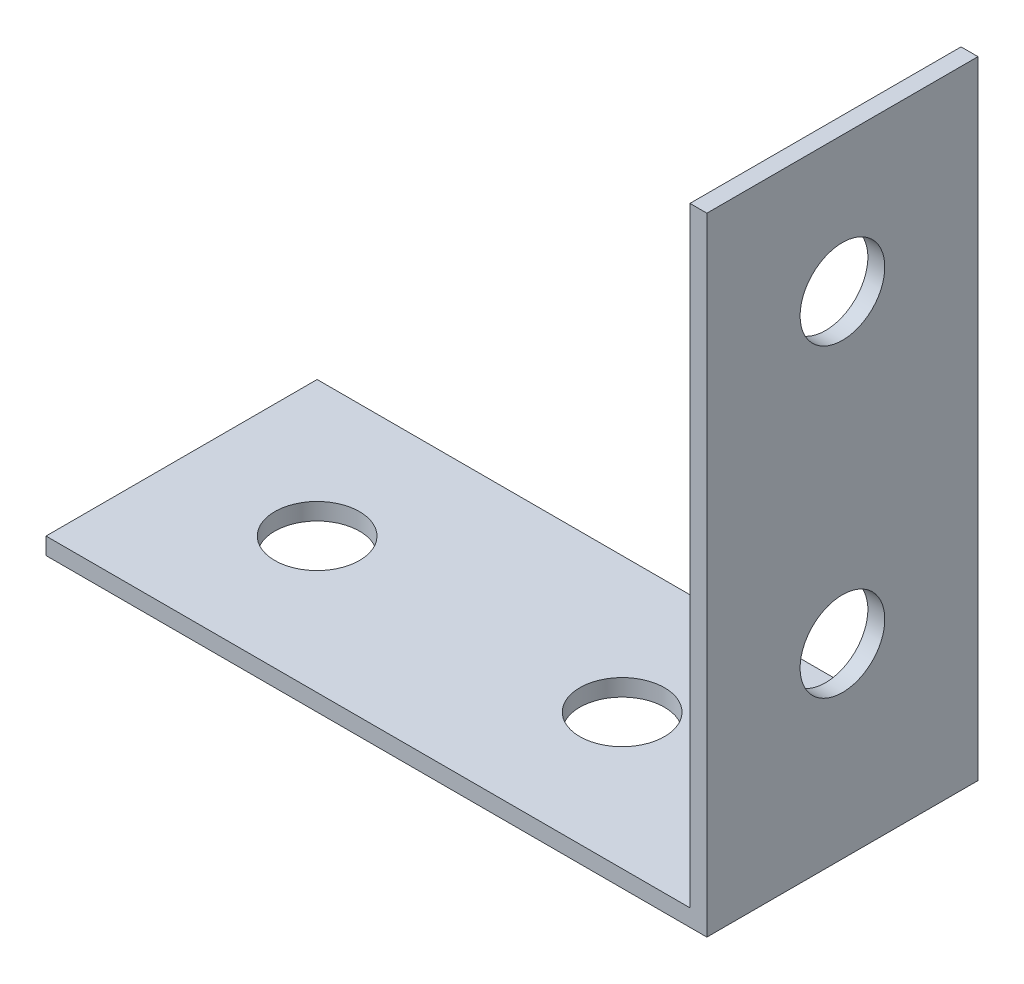
ISO-10303-21;
HEADER;
FILE_DESCRIPTION(('STEP AP214'),'2;1');
FILE_NAME('part.step','',(''),(''),'','','');
FILE_SCHEMA(('AUTOMOTIVE_DESIGN { 1 0 10303 214 1 1 1 1 }'));
ENDSEC;
DATA;
#1=APPLICATION_CONTEXT('core data for automotive mechanical design processes');
#2=APPLICATION_PROTOCOL_DEFINITION('international standard','automotive_design',2000,#1);
#3=PRODUCT_CONTEXT('',#1,'mechanical');
#4=PRODUCT('Part','Part','',(#3));
#5=PRODUCT_RELATED_PRODUCT_CATEGORY('part','',(#4));
#6=PRODUCT_DEFINITION_FORMATION('','',#4);
#7=PRODUCT_DEFINITION_CONTEXT('part definition',#1,'design');
#8=PRODUCT_DEFINITION('design','',#6,#7);
#9=PRODUCT_DEFINITION_SHAPE('','',#8);
#10=(LENGTH_UNIT() NAMED_UNIT(*) SI_UNIT(.MILLI.,.METRE.));
#11=(NAMED_UNIT(*) PLANE_ANGLE_UNIT() SI_UNIT($,.RADIAN.));
#12=(NAMED_UNIT(*) SI_UNIT($,.STERADIAN.) SOLID_ANGLE_UNIT());
#13=UNCERTAINTY_MEASURE_WITH_UNIT(LENGTH_MEASURE(1.E-05),#10,'distance_accuracy_value','');
#14=(GEOMETRIC_REPRESENTATION_CONTEXT(3) GLOBAL_UNCERTAINTY_ASSIGNED_CONTEXT((#13)) GLOBAL_UNIT_ASSIGNED_CONTEXT((#10,
#11,#12)) REPRESENTATION_CONTEXT('',''));
#15=CARTESIAN_POINT('',(0.,0.,0.));
#16=DIRECTION('',(0.,0.,1.));
#17=DIRECTION('',(1.,0.,0.));
#18=AXIS2_PLACEMENT_3D('',#15,#16,#17);
#19=CARTESIAN_POINT('',(-19.,1.,-8.));
#20=DIRECTION('',(0.,0.,1.));
#21=DIRECTION('',(1.,0.,0.));
#22=AXIS2_PLACEMENT_3D('',#19,#20,#21);
#23=PLANE('',#22);
#24=DIRECTION('',(-1.,0.,0.));
#25=VECTOR('',#24,1.);
#26=CARTESIAN_POINT('',(-19.,0.,-8.));
#27=LINE('',#26,#25);
#28=CARTESIAN_POINT('',(20.,0.,-8.));
#29=VERTEX_POINT('',#28);
#30=CARTESIAN_POINT('',(-19.,0.,-8.));
#31=VERTEX_POINT('',#30);
#32=EDGE_CURVE('E64',#29,#31,#27,.T.);
#33=ORIENTED_EDGE('',*,*,#32,.T.);
#34=DIRECTION('',(0.,-1.,0.));
#35=VECTOR('',#34,1.);
#36=CARTESIAN_POINT('',(-19.,1.,-8.));
#37=LINE('',#36,#35);
#38=CARTESIAN_POINT('',(-19.,1.,-8.));
#39=VERTEX_POINT('',#38);
#40=EDGE_CURVE('E11',#39,#31,#37,.T.);
#41=ORIENTED_EDGE('',*,*,#40,.F.);
#42=DIRECTION('',(-1.,0.,0.));
#43=VECTOR('',#42,1.);
#44=CARTESIAN_POINT('',(-19.,1.,-8.));
#45=LINE('',#44,#43);
#46=CARTESIAN_POINT('',(19.,1.,-8.));
#47=VERTEX_POINT('',#46);
#48=EDGE_CURVE('E93',#47,#39,#45,.T.);
#49=ORIENTED_EDGE('',*,*,#48,.F.);
#50=DIRECTION('',(0.,1.,0.));
#51=VECTOR('',#50,1.);
#52=CARTESIAN_POINT('',(19.,0.,-8.));
#53=LINE('',#52,#51);
#54=CARTESIAN_POINT('',(19.,37.,-8.));
#55=VERTEX_POINT('',#54);
#56=EDGE_CURVE('E83',#47,#55,#53,.T.);
#57=ORIENTED_EDGE('',*,*,#56,.T.);
#58=DIRECTION('',(-1.,0.,0.));
#59=VECTOR('',#58,1.);
#60=CARTESIAN_POINT('',(20.,37.,-8.));
#61=LINE('',#60,#59);
#62=CARTESIAN_POINT('',(20.,37.,-8.));
#63=VERTEX_POINT('',#62);
#64=EDGE_CURVE('E104',#63,#55,#61,.T.);
#65=ORIENTED_EDGE('',*,*,#64,.F.);
#66=DIRECTION('',(0.,1.,0.));
#67=VECTOR('',#66,1.);
#68=CARTESIAN_POINT('',(20.,0.,-8.));
#69=LINE('',#68,#67);
#70=EDGE_CURVE('E128',#29,#63,#69,.T.);
#71=ORIENTED_EDGE('',*,*,#70,.F.);
#72=EDGE_LOOP('',(#33,#41,#49,#57,#65,#71));
#73=FACE_BOUND('',#72,.T.);
#74=ADVANCED_FACE('F36',(#73),#23,.F.);
#75=CARTESIAN_POINT('',(-19.,1.,-8.));
#76=DIRECTION('',(1.,0.,0.));
#77=DIRECTION('',(0.,0.,-1.));
#78=AXIS2_PLACEMENT_3D('',#75,#76,#77);
#79=PLANE('',#78);
#80=DIRECTION('',(0.,0.,1.));
#81=VECTOR('',#80,1.);
#82=CARTESIAN_POINT('',(-19.,0.,-8.));
#83=LINE('',#82,#81);
#84=CARTESIAN_POINT('',(-19.,0.,8.));
#85=VERTEX_POINT('',#84);
#86=EDGE_CURVE('E101',#31,#85,#83,.T.);
#87=ORIENTED_EDGE('',*,*,#86,.T.);
#88=DIRECTION('',(0.,-1.,0.));
#89=VECTOR('',#88,1.);
#90=CARTESIAN_POINT('',(-19.,1.,8.));
#91=LINE('',#90,#89);
#92=CARTESIAN_POINT('',(-19.,1.,8.));
#93=VERTEX_POINT('',#92);
#94=EDGE_CURVE('E44',#93,#85,#91,.T.);
#95=ORIENTED_EDGE('',*,*,#94,.F.);
#96=DIRECTION('',(0.,0.,1.));
#97=VECTOR('',#96,1.);
#98=CARTESIAN_POINT('',(-19.,1.,-8.));
#99=LINE('',#98,#97);
#100=EDGE_CURVE('E52',#39,#93,#99,.T.);
#101=ORIENTED_EDGE('',*,*,#100,.F.);
#102=ORIENTED_EDGE('',*,*,#40,.T.);
#103=EDGE_LOOP('',(#87,#95,#101,#102));
#104=FACE_BOUND('',#103,.T.);
#105=ADVANCED_FACE('F163',(#104),#79,.F.);
#106=CARTESIAN_POINT('',(-19.,1.,8.));
#107=DIRECTION('',(0.,0.,-1.));
#108=DIRECTION('',(-1.,0.,0.));
#109=AXIS2_PLACEMENT_3D('',#106,#107,#108);
#110=PLANE('',#109);
#111=DIRECTION('',(1.,0.,0.));
#112=VECTOR('',#111,1.);
#113=CARTESIAN_POINT('',(-19.,0.,8.));
#114=LINE('',#113,#112);
#115=CARTESIAN_POINT('',(20.,0.,8.));
#116=VERTEX_POINT('',#115);
#117=EDGE_CURVE('E98',#85,#116,#114,.T.);
#118=ORIENTED_EDGE('',*,*,#117,.T.);
#119=DIRECTION('',(0.,-1.,0.));
#120=VECTOR('',#119,1.);
#121=CARTESIAN_POINT('',(20.,0.,8.));
#122=LINE('',#121,#120);
#123=CARTESIAN_POINT('',(20.,37.,8.));
#124=VERTEX_POINT('',#123);
#125=EDGE_CURVE('E129',#124,#116,#122,.T.);
#126=ORIENTED_EDGE('',*,*,#125,.F.);
#127=DIRECTION('',(-1.,0.,0.));
#128=VECTOR('',#127,1.);
#129=CARTESIAN_POINT('',(20.,37.,8.));
#130=LINE('',#129,#128);
#131=CARTESIAN_POINT('',(19.,37.,8.));
#132=VERTEX_POINT('',#131);
#133=EDGE_CURVE('E144',#124,#132,#130,.T.);
#134=ORIENTED_EDGE('',*,*,#133,.T.);
#135=DIRECTION('',(0.,-1.,0.));
#136=VECTOR('',#135,1.);
#137=CARTESIAN_POINT('',(19.,0.,8.));
#138=LINE('',#137,#136);
#139=CARTESIAN_POINT('',(19.,1.,8.));
#140=VERTEX_POINT('',#139);
#141=EDGE_CURVE('E91',#132,#140,#138,.T.);
#142=ORIENTED_EDGE('',*,*,#141,.T.);
#143=DIRECTION('',(1.,0.,0.));
#144=VECTOR('',#143,1.);
#145=CARTESIAN_POINT('',(-19.,1.,8.));
#146=LINE('',#145,#144);
#147=EDGE_CURVE('E97',#93,#140,#146,.T.);
#148=ORIENTED_EDGE('',*,*,#147,.F.);
#149=ORIENTED_EDGE('',*,*,#94,.T.);
#150=EDGE_LOOP('',(#118,#126,#134,#142,#148,#149));
#151=FACE_BOUND('',#150,.T.);
#152=ADVANCED_FACE('F113',(#151),#110,.F.);
#153=CARTESIAN_POINT('',(0.,1.,0.));
#154=DIRECTION('',(0.,1.,0.));
#155=DIRECTION('',(0.,0.,1.));
#156=AXIS2_PLACEMENT_3D('',#153,#154,#155);
#157=PLANE('',#156);
#158=CARTESIAN_POINT('',(-11.,1.,0.));
#159=DIRECTION('',(0.,1.,0.));
#160=DIRECTION('',(0.,0.,1.));
#161=AXIS2_PLACEMENT_3D('',#158,#159,#160);
#162=CIRCLE('',#161,2.5);
#163=CARTESIAN_POINT('',(-11.,1.,2.5));
#164=VERTEX_POINT('',#163);
#165=EDGE_CURVE('E181',#164,#164,#162,.T.);
#166=ORIENTED_EDGE('',*,*,#165,.F.);
#167=EDGE_LOOP('',(#166));
#168=FACE_BOUND('',#167,.T.);
#169=CARTESIAN_POINT('',(7.,1.,0.));
#170=DIRECTION('',(0.,1.,0.));
#171=DIRECTION('',(0.,0.,1.));
#172=AXIS2_PLACEMENT_3D('',#169,#170,#171);
#173=CIRCLE('',#172,2.5);
#174=CARTESIAN_POINT('',(7.,1.,2.5));
#175=VERTEX_POINT('',#174);
#176=EDGE_CURVE('E184',#175,#175,#173,.T.);
#177=ORIENTED_EDGE('',*,*,#176,.F.);
#178=EDGE_LOOP('',(#177));
#179=FACE_BOUND('',#178,.T.);
#180=DIRECTION('',(0.,0.,-1.));
#181=VECTOR('',#180,1.);
#182=CARTESIAN_POINT('',(19.,1.,-8.));
#183=LINE('',#182,#181);
#184=EDGE_CURVE('E73',#140,#47,#183,.T.);
#185=ORIENTED_EDGE('',*,*,#184,.T.);
#186=ORIENTED_EDGE('',*,*,#48,.T.);
#187=ORIENTED_EDGE('',*,*,#100,.T.);
#188=ORIENTED_EDGE('',*,*,#147,.T.);
#189=EDGE_LOOP('',(#185,#186,#187,#188));
#190=FACE_BOUND('',#189,.T.);
#191=ADVANCED_FACE('F95',(#168,#179,#190),#157,.T.);
#192=CARTESIAN_POINT('',(0.,0.,0.));
#193=DIRECTION('',(0.,1.,0.));
#194=DIRECTION('',(0.,0.,1.));
#195=AXIS2_PLACEMENT_3D('',#192,#193,#194);
#196=PLANE('',#195);
#197=CARTESIAN_POINT('',(-11.,0.,0.));
#198=DIRECTION('',(0.,1.,0.));
#199=DIRECTION('',(0.,0.,1.));
#200=AXIS2_PLACEMENT_3D('',#197,#198,#199);
#201=CIRCLE('',#200,2.5);
#202=CARTESIAN_POINT('',(-11.,0.,2.5));
#203=VERTEX_POINT('',#202);
#204=EDGE_CURVE('E145',#203,#203,#201,.F.);
#205=ORIENTED_EDGE('',*,*,#204,.F.);
#206=EDGE_LOOP('',(#205));
#207=FACE_BOUND('',#206,.T.);
#208=CARTESIAN_POINT('',(7.,0.,0.));
#209=DIRECTION('',(0.,1.,0.));
#210=DIRECTION('',(0.,0.,1.));
#211=AXIS2_PLACEMENT_3D('',#208,#209,#210);
#212=CIRCLE('',#211,2.5);
#213=CARTESIAN_POINT('',(7.,0.,2.5));
#214=VERTEX_POINT('',#213);
#215=EDGE_CURVE('E139',#214,#214,#212,.F.);
#216=ORIENTED_EDGE('',*,*,#215,.F.);
#217=EDGE_LOOP('',(#216));
#218=FACE_BOUND('',#217,.T.);
#219=ORIENTED_EDGE('',*,*,#32,.F.);
#220=DIRECTION('',(0.,0.,-1.));
#221=VECTOR('',#220,1.);
#222=CARTESIAN_POINT('',(20.,0.,8.));
#223=LINE('',#222,#221);
#224=EDGE_CURVE('E122',#116,#29,#223,.T.);
#225=ORIENTED_EDGE('',*,*,#224,.F.);
#226=ORIENTED_EDGE('',*,*,#117,.F.);
#227=ORIENTED_EDGE('',*,*,#86,.F.);
#228=EDGE_LOOP('',(#219,#225,#226,#227));
#229=FACE_BOUND('',#228,.T.);
#230=ADVANCED_FACE('F120',(#207,#218,#229),#196,.F.);
#231=CARTESIAN_POINT('',(19.,0.,0.));
#232=DIRECTION('',(-1.,0.,0.));
#233=DIRECTION('',(0.,0.,1.));
#234=AXIS2_PLACEMENT_3D('',#231,#232,#233);
#235=PLANE('',#234);
#236=CARTESIAN_POINT('',(19.,29.,0.));
#237=DIRECTION('',(-1.,0.,0.));
#238=DIRECTION('',(0.,0.,1.));
#239=AXIS2_PLACEMENT_3D('',#236,#237,#238);
#240=CIRCLE('',#239,2.5);
#241=CARTESIAN_POINT('',(19.,29.,2.5));
#242=VERTEX_POINT('',#241);
#243=EDGE_CURVE('E189',#242,#242,#240,.T.);
#244=ORIENTED_EDGE('',*,*,#243,.F.);
#245=EDGE_LOOP('',(#244));
#246=FACE_BOUND('',#245,.T.);
#247=CARTESIAN_POINT('',(19.,11.,0.));
#248=DIRECTION('',(-1.,0.,0.));
#249=DIRECTION('',(0.,0.,1.));
#250=AXIS2_PLACEMENT_3D('',#247,#248,#249);
#251=CIRCLE('',#250,2.5);
#252=CARTESIAN_POINT('',(19.,11.,2.5));
#253=VERTEX_POINT('',#252);
#254=EDGE_CURVE('E198',#253,#253,#251,.T.);
#255=ORIENTED_EDGE('',*,*,#254,.F.);
#256=EDGE_LOOP('',(#255));
#257=FACE_BOUND('',#256,.T.);
#258=ORIENTED_EDGE('',*,*,#184,.F.);
#259=ORIENTED_EDGE('',*,*,#141,.F.);
#260=DIRECTION('',(0.,0.,1.));
#261=VECTOR('',#260,1.);
#262=CARTESIAN_POINT('',(19.,37.,8.));
#263=LINE('',#262,#261);
#264=EDGE_CURVE('E88',#55,#132,#263,.T.);
#265=ORIENTED_EDGE('',*,*,#264,.F.);
#266=ORIENTED_EDGE('',*,*,#56,.F.);
#267=EDGE_LOOP('',(#258,#259,#265,#266));
#268=FACE_BOUND('',#267,.T.);
#269=ADVANCED_FACE('F85',(#246,#257,#268),#235,.T.);
#270=CARTESIAN_POINT('',(20.,37.,8.));
#271=DIRECTION('',(0.,-1.,0.));
#272=DIRECTION('',(0.,0.,-1.));
#273=AXIS2_PLACEMENT_3D('',#270,#271,#272);
#274=PLANE('',#273);
#275=ORIENTED_EDGE('',*,*,#264,.T.);
#276=ORIENTED_EDGE('',*,*,#133,.F.);
#277=DIRECTION('',(0.,0.,1.));
#278=VECTOR('',#277,1.);
#279=CARTESIAN_POINT('',(20.,37.,8.));
#280=LINE('',#279,#278);
#281=EDGE_CURVE('E133',#63,#124,#280,.T.);
#282=ORIENTED_EDGE('',*,*,#281,.F.);
#283=ORIENTED_EDGE('',*,*,#64,.T.);
#284=EDGE_LOOP('',(#275,#276,#282,#283));
#285=FACE_BOUND('',#284,.T.);
#286=ADVANCED_FACE('F147',(#285),#274,.F.);
#287=CARTESIAN_POINT('',(20.,0.,0.));
#288=DIRECTION('',(-1.,0.,0.));
#289=DIRECTION('',(0.,0.,1.));
#290=AXIS2_PLACEMENT_3D('',#287,#288,#289);
#291=PLANE('',#290);
#292=CARTESIAN_POINT('',(20.,29.,0.));
#293=DIRECTION('',(-1.,0.,0.));
#294=DIRECTION('',(0.,0.,1.));
#295=AXIS2_PLACEMENT_3D('',#292,#293,#294);
#296=CIRCLE('',#295,2.5);
#297=CARTESIAN_POINT('',(20.,29.,2.5));
#298=VERTEX_POINT('',#297);
#299=EDGE_CURVE('E186',#298,#298,#296,.F.);
#300=ORIENTED_EDGE('',*,*,#299,.F.);
#301=EDGE_LOOP('',(#300));
#302=FACE_BOUND('',#301,.T.);
#303=CARTESIAN_POINT('',(20.,11.,0.));
#304=DIRECTION('',(-1.,0.,0.));
#305=DIRECTION('',(0.,0.,1.));
#306=AXIS2_PLACEMENT_3D('',#303,#304,#305);
#307=CIRCLE('',#306,2.5);
#308=CARTESIAN_POINT('',(20.,11.,2.5));
#309=VERTEX_POINT('',#308);
#310=EDGE_CURVE('E195',#309,#309,#307,.F.);
#311=ORIENTED_EDGE('',*,*,#310,.F.);
#312=EDGE_LOOP('',(#311));
#313=FACE_BOUND('',#312,.T.);
#314=ORIENTED_EDGE('',*,*,#125,.T.);
#315=ORIENTED_EDGE('',*,*,#224,.T.);
#316=ORIENTED_EDGE('',*,*,#70,.T.);
#317=ORIENTED_EDGE('',*,*,#281,.T.);
#318=EDGE_LOOP('',(#314,#315,#316,#317));
#319=FACE_BOUND('',#318,.T.);
#320=ADVANCED_FACE('F131',(#302,#313,#319),#291,.F.);
#321=CARTESIAN_POINT('',(7.,-0.000999999999999916,0.));
#322=DIRECTION('',(0.,1.,0.));
#323=DIRECTION('',(0.,0.,1.));
#324=AXIS2_PLACEMENT_3D('',#321,#322,#323);
#325=CYLINDRICAL_SURFACE('',#324,2.5);
#326=ORIENTED_EDGE('',*,*,#176,.T.);
#327=EDGE_LOOP('',(#326));
#328=FACE_BOUND('',#327,.T.);
#329=ORIENTED_EDGE('',*,*,#215,.T.);
#330=EDGE_LOOP('',(#329));
#331=FACE_BOUND('',#330,.T.);
#332=ADVANCED_FACE('F156',(#328,#331),#325,.F.);
#333=CARTESIAN_POINT('',(-11.,-0.000999999999999916,0.));
#334=DIRECTION('',(0.,1.,0.));
#335=DIRECTION('',(0.,0.,1.));
#336=AXIS2_PLACEMENT_3D('',#333,#334,#335);
#337=CYLINDRICAL_SURFACE('',#336,2.5);
#338=ORIENTED_EDGE('',*,*,#165,.T.);
#339=EDGE_LOOP('',(#338));
#340=FACE_BOUND('',#339,.T.);
#341=ORIENTED_EDGE('',*,*,#204,.T.);
#342=EDGE_LOOP('',(#341));
#343=FACE_BOUND('',#342,.T.);
#344=ADVANCED_FACE('F212',(#340,#343),#337,.F.);
#345=CARTESIAN_POINT('',(20.001,11.,0.));
#346=DIRECTION('',(-1.,0.,0.));
#347=DIRECTION('',(0.,0.,1.));
#348=AXIS2_PLACEMENT_3D('',#345,#346,#347);
#349=CYLINDRICAL_SURFACE('',#348,2.5);
#350=ORIENTED_EDGE('',*,*,#254,.T.);
#351=EDGE_LOOP('',(#350));
#352=FACE_BOUND('',#351,.T.);
#353=ORIENTED_EDGE('',*,*,#310,.T.);
#354=EDGE_LOOP('',(#353));
#355=FACE_BOUND('',#354,.T.);
#356=ADVANCED_FACE('F209',(#352,#355),#349,.F.);
#357=CARTESIAN_POINT('',(20.001,29.,0.));
#358=DIRECTION('',(-1.,0.,0.));
#359=DIRECTION('',(0.,0.,1.));
#360=AXIS2_PLACEMENT_3D('',#357,#358,#359);
#361=CYLINDRICAL_SURFACE('',#360,2.5);
#362=ORIENTED_EDGE('',*,*,#243,.T.);
#363=EDGE_LOOP('',(#362));
#364=FACE_BOUND('',#363,.T.);
#365=ORIENTED_EDGE('',*,*,#299,.T.);
#366=EDGE_LOOP('',(#365));
#367=FACE_BOUND('',#366,.T.);
#368=ADVANCED_FACE('F204',(#364,#367),#361,.F.);
#369=CLOSED_SHELL('',(#74,#105,#152,#191,#230,#269,#286,#320,#332,#344,#356,#368));
#370=MANIFOLD_SOLID_BREP('B2',#369);
#371=ADVANCED_BREP_SHAPE_REPRESENTATION('',(#18,#370),#14);
#372=SHAPE_DEFINITION_REPRESENTATION(#9,#371);
ENDSEC;
END-ISO-10303-21;
